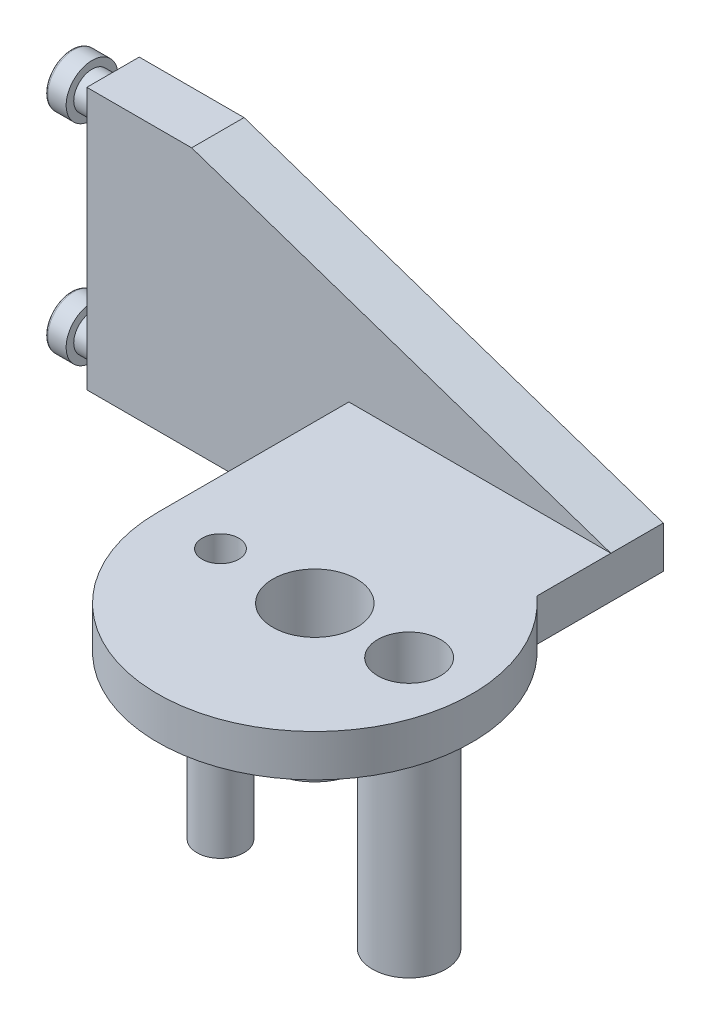
ISO-10303-21;
HEADER;
FILE_DESCRIPTION(('STEP AP214'),'2;1');
FILE_NAME('part.step','',(''),(''),'','','');
FILE_SCHEMA(('AUTOMOTIVE_DESIGN { 1 0 10303 214 1 1 1 1 }'));
ENDSEC;
DATA;
#1=APPLICATION_CONTEXT('core data for automotive mechanical design processes');
#2=APPLICATION_PROTOCOL_DEFINITION('international standard','automotive_design',2000,#1);
#3=PRODUCT_CONTEXT('',#1,'mechanical');
#4=PRODUCT('Part','Part','',(#3));
#5=PRODUCT_RELATED_PRODUCT_CATEGORY('part','',(#4));
#6=PRODUCT_DEFINITION_FORMATION('','',#4);
#7=PRODUCT_DEFINITION_CONTEXT('part definition',#1,'design');
#8=PRODUCT_DEFINITION('design','',#6,#7);
#9=PRODUCT_DEFINITION_SHAPE('','',#8);
#10=(LENGTH_UNIT() NAMED_UNIT(*) SI_UNIT(.MILLI.,.METRE.));
#11=(NAMED_UNIT(*) PLANE_ANGLE_UNIT() SI_UNIT($,.RADIAN.));
#12=(NAMED_UNIT(*) SI_UNIT($,.STERADIAN.) SOLID_ANGLE_UNIT());
#13=UNCERTAINTY_MEASURE_WITH_UNIT(LENGTH_MEASURE(1.E-05),#10,'distance_accuracy_value','');
#14=(GEOMETRIC_REPRESENTATION_CONTEXT(3) GLOBAL_UNCERTAINTY_ASSIGNED_CONTEXT((#13)) GLOBAL_UNIT_ASSIGNED_CONTEXT((#10,
#11,#12)) REPRESENTATION_CONTEXT('',''));
#15=CARTESIAN_POINT('',(0.,0.,0.));
#16=DIRECTION('',(0.,0.,1.));
#17=DIRECTION('',(1.,0.,0.));
#18=AXIS2_PLACEMENT_3D('',#15,#16,#17);
#19=CARTESIAN_POINT('',(-50.,-25.,10.));
#20=DIRECTION('',(1.,0.,0.));
#21=DIRECTION('',(0.,0.,-1.));
#22=AXIS2_PLACEMENT_3D('',#19,#20,#21);
#23=PLANE('',#22);
#24=CARTESIAN_POINT('',(-50.,20.,5.));
#25=DIRECTION('',(1.,0.,0.));
#26=DIRECTION('',(0.,0.,-1.));
#27=AXIS2_PLACEMENT_3D('',#24,#25,#26);
#28=CIRCLE('',#27,3.5);
#29=CARTESIAN_POINT('',(-50.,20.,1.5));
#30=VERTEX_POINT('',#29);
#31=EDGE_CURVE('E177',#30,#30,#28,.F.);
#32=ORIENTED_EDGE('',*,*,#31,.F.);
#33=EDGE_LOOP('',(#32));
#34=FACE_BOUND('',#33,.T.);
#35=CARTESIAN_POINT('',(-50.,-20.,5.));
#36=DIRECTION('',(1.,0.,0.));
#37=DIRECTION('',(0.,0.,-1.));
#38=AXIS2_PLACEMENT_3D('',#35,#36,#37);
#39=CIRCLE('',#38,3.5);
#40=CARTESIAN_POINT('',(-50.,-20.,1.5));
#41=VERTEX_POINT('',#40);
#42=EDGE_CURVE('E173',#41,#41,#39,.F.);
#43=ORIENTED_EDGE('',*,*,#42,.F.);
#44=EDGE_LOOP('',(#43));
#45=FACE_BOUND('',#44,.T.);
#46=DIRECTION('',(0.,-1.,0.));
#47=VECTOR('',#46,1.);
#48=CARTESIAN_POINT('',(-50.,-25.,0.));
#49=LINE('',#48,#47);
#50=CARTESIAN_POINT('',(-50.,25.,0.));
#51=VERTEX_POINT('',#50);
#52=CARTESIAN_POINT('',(-50.,-25.,0.));
#53=VERTEX_POINT('',#52);
#54=EDGE_CURVE('E160',#51,#53,#49,.T.);
#55=ORIENTED_EDGE('',*,*,#54,.T.);
#56=DIRECTION('',(0.,0.,-1.));
#57=VECTOR('',#56,1.);
#58=CARTESIAN_POINT('',(-50.,-25.,10.));
#59=LINE('',#58,#57);
#60=CARTESIAN_POINT('',(-50.,-25.,10.));
#61=VERTEX_POINT('',#60);
#62=EDGE_CURVE('E168',#61,#53,#59,.T.);
#63=ORIENTED_EDGE('',*,*,#62,.F.);
#64=DIRECTION('',(0.,-1.,0.));
#65=VECTOR('',#64,1.);
#66=CARTESIAN_POINT('',(-50.,-25.,10.));
#67=LINE('',#66,#65);
#68=CARTESIAN_POINT('',(-50.,25.,10.));
#69=VERTEX_POINT('',#68);
#70=EDGE_CURVE('E158',#69,#61,#67,.T.);
#71=ORIENTED_EDGE('',*,*,#70,.F.);
#72=DIRECTION('',(0.,0.,-1.));
#73=VECTOR('',#72,1.);
#74=CARTESIAN_POINT('',(-50.,25.,10.));
#75=LINE('',#74,#73);
#76=EDGE_CURVE('E164',#69,#51,#75,.T.);
#77=ORIENTED_EDGE('',*,*,#76,.T.);
#78=EDGE_LOOP('',(#55,#63,#71,#77));
#79=FACE_BOUND('',#78,.T.);
#80=ADVANCED_FACE('F47',(#34,#45,#79),#23,.F.);
#81=CARTESIAN_POINT('',(50.,-25.,10.));
#82=DIRECTION('',(0.,1.,0.));
#83=DIRECTION('',(-1.,0.,0.));
#84=AXIS2_PLACEMENT_3D('',#81,#82,#83);
#85=PLANE('',#84);
#86=DIRECTION('',(1.,0.,0.));
#87=VECTOR('',#86,1.);
#88=CARTESIAN_POINT('',(50.,-25.,0.));
#89=LINE('',#88,#87);
#90=CARTESIAN_POINT('',(-17.9999999999998,-25.,0.));
#91=VERTEX_POINT('',#90);
#92=EDGE_CURVE('E154',#53,#91,#89,.T.);
#93=ORIENTED_EDGE('',*,*,#92,.T.);
#94=DIRECTION('',(0.,0.,1.));
#95=VECTOR('',#94,1.);
#96=CARTESIAN_POINT('',(-18.,-25.,0.));
#97=LINE('',#96,#95);
#98=CARTESIAN_POINT('',(-18.,-25.,10.));
#99=VERTEX_POINT('',#98);
#100=EDGE_CURVE('E130',#91,#99,#97,.T.);
#101=ORIENTED_EDGE('',*,*,#100,.T.);
#102=DIRECTION('',(1.,0.,0.));
#103=VECTOR('',#102,1.);
#104=CARTESIAN_POINT('',(50.,-25.,10.));
#105=LINE('',#104,#103);
#106=EDGE_CURVE('E363',#61,#99,#105,.T.);
#107=ORIENTED_EDGE('',*,*,#106,.F.);
#108=ORIENTED_EDGE('',*,*,#62,.T.);
#109=EDGE_LOOP('',(#93,#101,#107,#108));
#110=FACE_BOUND('',#109,.T.);
#111=ADVANCED_FACE('F240',(#110),#85,.F.);
#112=CARTESIAN_POINT('',(50.,25.,10.));
#113=DIRECTION('',(-1.,0.,0.));
#114=DIRECTION('',(0.,0.,1.));
#115=AXIS2_PLACEMENT_3D('',#112,#113,#114);
#116=PLANE('',#115);
#117=DIRECTION('',(0.,0.,-1.));
#118=VECTOR('',#117,1.);
#119=CARTESIAN_POINT('',(50.,-10.,10.));
#120=LINE('',#119,#118);
#121=CARTESIAN_POINT('',(50.,-10.,24.1393202250021));
#122=VERTEX_POINT('',#121);
#123=CARTESIAN_POINT('',(50.,-10.,10.));
#124=VERTEX_POINT('',#123);
#125=EDGE_CURVE('E145',#122,#124,#120,.T.);
#126=ORIENTED_EDGE('',*,*,#125,.T.);
#127=DIRECTION('',(0.,0.,1.));
#128=VECTOR('',#127,1.);
#129=CARTESIAN_POINT('',(50.,-10.,0.));
#130=LINE('',#129,#128);
#131=CARTESIAN_POINT('',(50.,-10.,0.));
#132=VERTEX_POINT('',#131);
#133=EDGE_CURVE('E127',#132,#124,#130,.T.);
#134=ORIENTED_EDGE('',*,*,#133,.F.);
#135=DIRECTION('',(0.,1.,0.));
#136=VECTOR('',#135,1.);
#137=CARTESIAN_POINT('',(50.,25.,0.));
#138=LINE('',#137,#136);
#139=CARTESIAN_POINT('',(50.,-2.,0.));
#140=VERTEX_POINT('',#139);
#141=EDGE_CURVE('E141',#132,#140,#138,.T.);
#142=ORIENTED_EDGE('',*,*,#141,.T.);
#143=DIRECTION('',(0.,0.,1.));
#144=VECTOR('',#143,1.);
#145=CARTESIAN_POINT('',(50.,-2.,0.));
#146=LINE('',#145,#144);
#147=CARTESIAN_POINT('',(50.,-2.,10.));
#148=VERTEX_POINT('',#147);
#149=EDGE_CURVE('E317',#140,#148,#146,.T.);
#150=ORIENTED_EDGE('',*,*,#149,.T.);
#151=DIRECTION('',(0.,0.,1.));
#152=VECTOR('',#151,1.);
#153=CARTESIAN_POINT('',(50.,-2.00000000000001,10.));
#154=LINE('',#153,#152);
#155=CARTESIAN_POINT('',(50.,-2.,24.1393202250021));
#156=VERTEX_POINT('',#155);
#157=EDGE_CURVE('E332',#148,#156,#154,.T.);
#158=ORIENTED_EDGE('',*,*,#157,.T.);
#159=DIRECTION('',(0.,1.,0.));
#160=VECTOR('',#159,1.);
#161=CARTESIAN_POINT('',(50.,-25.,24.1393202250021));
#162=LINE('',#161,#160);
#163=EDGE_CURVE('E336',#122,#156,#162,.T.);
#164=ORIENTED_EDGE('',*,*,#163,.F.);
#165=EDGE_LOOP('',(#126,#134,#142,#150,#158,#164));
#166=FACE_BOUND('',#165,.T.);
#167=ADVANCED_FACE('F139',(#166),#116,.F.);
#168=CARTESIAN_POINT('',(-50.,25.,10.));
#169=DIRECTION('',(0.,-1.,0.));
#170=DIRECTION('',(0.,0.,-1.));
#171=AXIS2_PLACEMENT_3D('',#168,#169,#170);
#172=PLANE('',#171);
#173=DIRECTION('',(-1.,0.,0.));
#174=VECTOR('',#173,1.);
#175=CARTESIAN_POINT('',(-50.,25.,10.));
#176=LINE('',#175,#174);
#177=CARTESIAN_POINT('',(-30.,25.,10.));
#178=VERTEX_POINT('',#177);
#179=EDGE_CURVE('E169',#178,#69,#176,.T.);
#180=ORIENTED_EDGE('',*,*,#179,.F.);
#181=DIRECTION('',(0.,0.,1.));
#182=VECTOR('',#181,1.);
#183=CARTESIAN_POINT('',(-30.,25.,0.));
#184=LINE('',#183,#182);
#185=CARTESIAN_POINT('',(-30.,25.,0.));
#186=VERTEX_POINT('',#185);
#187=EDGE_CURVE('E314',#186,#178,#184,.T.);
#188=ORIENTED_EDGE('',*,*,#187,.F.);
#189=DIRECTION('',(-1.,0.,0.));
#190=VECTOR('',#189,1.);
#191=CARTESIAN_POINT('',(-50.,25.,0.));
#192=LINE('',#191,#190);
#193=EDGE_CURVE('E153',#186,#51,#192,.T.);
#194=ORIENTED_EDGE('',*,*,#193,.T.);
#195=ORIENTED_EDGE('',*,*,#76,.F.);
#196=EDGE_LOOP('',(#180,#188,#194,#195));
#197=FACE_BOUND('',#196,.T.);
#198=ADVANCED_FACE('F384',(#197),#172,.F.);
#199=CARTESIAN_POINT('',(0.,0.,10.));
#200=DIRECTION('',(0.,0.,-1.));
#201=DIRECTION('',(-1.,0.,0.));
#202=AXIS2_PLACEMENT_3D('',#199,#200,#201);
#203=PLANE('',#202);
#204=ORIENTED_EDGE('',*,*,#106,.T.);
#205=DIRECTION('',(-0.976523773463931,-0.215409655911161,0.));
#206=VECTOR('',#205,1.);
#207=CARTESIAN_POINT('',(50.,-10.,10.));
#208=LINE('',#207,#206);
#209=EDGE_CURVE('E135',#124,#99,#208,.T.);
#210=ORIENTED_EDGE('',*,*,#209,.F.);
#211=DIRECTION('',(-1.,0.,0.));
#212=VECTOR('',#211,1.);
#213=CARTESIAN_POINT('',(60.,-10.,9.99999999999999));
#214=LINE('',#213,#212);
#215=CARTESIAN_POINT('',(0.,-10.,10.));
#216=VERTEX_POINT('',#215);
#217=EDGE_CURVE('E303',#124,#216,#214,.T.);
#218=ORIENTED_EDGE('',*,*,#217,.T.);
#219=DIRECTION('',(0.,1.,0.));
#220=VECTOR('',#219,1.);
#221=CARTESIAN_POINT('',(0.,-25.,10.));
#222=LINE('',#221,#220);
#223=CARTESIAN_POINT('',(0.,-2.,10.));
#224=VERTEX_POINT('',#223);
#225=EDGE_CURVE('E341',#216,#224,#222,.T.);
#226=ORIENTED_EDGE('',*,*,#225,.T.);
#227=DIRECTION('',(-1.,0.,0.));
#228=VECTOR('',#227,1.);
#229=CARTESIAN_POINT('',(60.,-2.00000000000001,9.99999999999999));
#230=LINE('',#229,#228);
#231=EDGE_CURVE('E187',#148,#224,#230,.T.);
#232=ORIENTED_EDGE('',*,*,#231,.F.);
#233=DIRECTION('',(0.947492278987199,-0.31977864415818,0.));
#234=VECTOR('',#233,1.);
#235=CARTESIAN_POINT('',(50.,-2.,10.));
#236=LINE('',#235,#234);
#237=EDGE_CURVE('E311',#178,#148,#236,.T.);
#238=ORIENTED_EDGE('',*,*,#237,.F.);
#239=ORIENTED_EDGE('',*,*,#179,.T.);
#240=ORIENTED_EDGE('',*,*,#70,.T.);
#241=EDGE_LOOP('',(#204,#210,#218,#226,#232,#238,#239,#240));
#242=FACE_BOUND('',#241,.T.);
#243=ADVANCED_FACE('F377',(#242),#203,.F.);
#244=CARTESIAN_POINT('',(0.,0.,0.));
#245=DIRECTION('',(0.,0.,-1.));
#246=DIRECTION('',(-1.,0.,0.));
#247=AXIS2_PLACEMENT_3D('',#244,#245,#246);
#248=PLANE('',#247);
#249=DIRECTION('',(-0.976523773463931,-0.215409655911161,0.));
#250=VECTOR('',#249,1.);
#251=CARTESIAN_POINT('',(50.,-10.,0.));
#252=LINE('',#251,#250);
#253=EDGE_CURVE('E124',#132,#91,#252,.T.);
#254=ORIENTED_EDGE('',*,*,#253,.T.);
#255=ORIENTED_EDGE('',*,*,#92,.F.);
#256=ORIENTED_EDGE('',*,*,#54,.F.);
#257=ORIENTED_EDGE('',*,*,#193,.F.);
#258=DIRECTION('',(0.947492278987199,-0.31977864415818,0.));
#259=VECTOR('',#258,1.);
#260=CARTESIAN_POINT('',(50.,-2.,0.));
#261=LINE('',#260,#259);
#262=EDGE_CURVE('E151',#186,#140,#261,.T.);
#263=ORIENTED_EDGE('',*,*,#262,.T.);
#264=ORIENTED_EDGE('',*,*,#141,.F.);
#265=EDGE_LOOP('',(#254,#255,#256,#257,#263,#264));
#266=FACE_BOUND('',#265,.T.);
#267=ADVANCED_FACE('F149',(#266),#248,.T.);
#268=CARTESIAN_POINT('',(-54.,-20.,5.));
#269=DIRECTION('',(1.,0.,0.));
#270=DIRECTION('',(0.,0.,-1.));
#271=AXIS2_PLACEMENT_3D('',#268,#269,#270);
#272=CYLINDRICAL_SURFACE('',#271,3.5);
#273=CARTESIAN_POINT('',(-54.,-20.,5.));
#274=DIRECTION('',(-1.,0.,0.));
#275=DIRECTION('',(0.,0.,1.));
#276=AXIS2_PLACEMENT_3D('',#273,#274,#275);
#277=CIRCLE('',#276,3.5);
#278=CARTESIAN_POINT('',(-54.,-20.,8.5));
#279=VERTEX_POINT('',#278);
#280=EDGE_CURVE('E350',#279,#279,#277,.T.);
#281=ORIENTED_EDGE('',*,*,#280,.F.);
#282=EDGE_LOOP('',(#281));
#283=FACE_BOUND('',#282,.T.);
#284=ORIENTED_EDGE('',*,*,#42,.T.);
#285=EDGE_LOOP('',(#284));
#286=FACE_BOUND('',#285,.T.);
#287=ADVANCED_FACE('F451',(#283,#286),#272,.T.);
#288=CARTESIAN_POINT('',(-54.,20.,5.));
#289=DIRECTION('',(1.,0.,0.));
#290=DIRECTION('',(0.,0.,-1.));
#291=AXIS2_PLACEMENT_3D('',#288,#289,#290);
#292=CYLINDRICAL_SURFACE('',#291,3.5);
#293=CARTESIAN_POINT('',(-54.,20.,5.));
#294=DIRECTION('',(-1.,0.,0.));
#295=DIRECTION('',(0.,0.,1.));
#296=AXIS2_PLACEMENT_3D('',#293,#294,#295);
#297=CIRCLE('',#296,3.5);
#298=CARTESIAN_POINT('',(-54.,20.,8.5));
#299=VERTEX_POINT('',#298);
#300=EDGE_CURVE('E354',#299,#299,#297,.T.);
#301=ORIENTED_EDGE('',*,*,#300,.F.);
#302=EDGE_LOOP('',(#301));
#303=FACE_BOUND('',#302,.T.);
#304=ORIENTED_EDGE('',*,*,#31,.T.);
#305=EDGE_LOOP('',(#304));
#306=FACE_BOUND('',#305,.T.);
#307=ADVANCED_FACE('F439',(#303,#306),#292,.T.);
#308=CARTESIAN_POINT('',(-58.,20.,5.));
#309=DIRECTION('',(1.,0.,0.));
#310=DIRECTION('',(0.,0.,-1.));
#311=AXIS2_PLACEMENT_3D('',#308,#309,#310);
#312=CYLINDRICAL_SURFACE('',#311,4.95);
#313=CARTESIAN_POINT('',(-57.5,20.,5.));
#314=DIRECTION('',(-1.,0.,0.));
#315=DIRECTION('',(0.,0.,1.));
#316=AXIS2_PLACEMENT_3D('',#313,#314,#315);
#317=CIRCLE('',#316,4.95);
#318=CARTESIAN_POINT('',(-57.5,20.,9.95));
#319=VERTEX_POINT('',#318);
#320=EDGE_CURVE('E11',#319,#319,#317,.F.);
#321=ORIENTED_EDGE('',*,*,#320,.T.);
#322=EDGE_LOOP('',(#321));
#323=FACE_BOUND('',#322,.T.);
#324=CARTESIAN_POINT('',(-54.,20.,5.));
#325=DIRECTION('',(-1.,0.,0.));
#326=DIRECTION('',(0.,0.,1.));
#327=AXIS2_PLACEMENT_3D('',#324,#325,#326);
#328=CIRCLE('',#327,4.95);
#329=CARTESIAN_POINT('',(-54.,20.,9.95));
#330=VERTEX_POINT('',#329);
#331=EDGE_CURVE('E346',#330,#330,#328,.T.);
#332=ORIENTED_EDGE('',*,*,#331,.T.);
#333=EDGE_LOOP('',(#332));
#334=FACE_BOUND('',#333,.T.);
#335=ADVANCED_FACE('F431',(#323,#334),#312,.T.);
#336=CARTESIAN_POINT('',(-58.,20.,5.));
#337=DIRECTION('',(-1.,0.,0.));
#338=DIRECTION('',(0.,0.,1.));
#339=AXIS2_PLACEMENT_3D('',#336,#337,#338);
#340=PLANE('',#339);
#341=CARTESIAN_POINT('',(-58.,20.,5.));
#342=DIRECTION('',(-1.,0.,0.));
#343=DIRECTION('',(0.,0.,1.));
#344=AXIS2_PLACEMENT_3D('',#341,#342,#343);
#345=CIRCLE('',#344,4.45);
#346=CARTESIAN_POINT('',(-58.,20.,9.45));
#347=VERTEX_POINT('',#346);
#348=EDGE_CURVE('E56',#347,#347,#345,.T.);
#349=ORIENTED_EDGE('',*,*,#348,.T.);
#350=EDGE_LOOP('',(#349));
#351=FACE_BOUND('',#350,.T.);
#352=ADVANCED_FACE('F427',(#351),#340,.T.);
#353=CARTESIAN_POINT('',(-54.,20.,5.));
#354=DIRECTION('',(-1.,0.,0.));
#355=DIRECTION('',(0.,0.,1.));
#356=AXIS2_PLACEMENT_3D('',#353,#354,#355);
#357=PLANE('',#356);
#358=ORIENTED_EDGE('',*,*,#300,.T.);
#359=EDGE_LOOP('',(#358));
#360=FACE_BOUND('',#359,.T.);
#361=ORIENTED_EDGE('',*,*,#331,.F.);
#362=EDGE_LOOP('',(#361));
#363=FACE_BOUND('',#362,.T.);
#364=ADVANCED_FACE('F430',(#360,#363),#357,.F.);
#365=CARTESIAN_POINT('',(-58.,-20.,5.));
#366=DIRECTION('',(1.,0.,0.));
#367=DIRECTION('',(0.,0.,-1.));
#368=AXIS2_PLACEMENT_3D('',#365,#366,#367);
#369=CYLINDRICAL_SURFACE('',#368,4.95);
#370=CARTESIAN_POINT('',(-57.5,-20.,5.));
#371=DIRECTION('',(-1.,0.,0.));
#372=DIRECTION('',(0.,0.,1.));
#373=AXIS2_PLACEMENT_3D('',#370,#371,#372);
#374=CIRCLE('',#373,4.95);
#375=CARTESIAN_POINT('',(-57.5,-20.,9.95));
#376=VERTEX_POINT('',#375);
#377=EDGE_CURVE('E744',#376,#376,#374,.F.);
#378=ORIENTED_EDGE('',*,*,#377,.T.);
#379=EDGE_LOOP('',(#378));
#380=FACE_BOUND('',#379,.T.);
#381=CARTESIAN_POINT('',(-54.,-20.,5.));
#382=DIRECTION('',(-1.,0.,0.));
#383=DIRECTION('',(0.,0.,1.));
#384=AXIS2_PLACEMENT_3D('',#381,#382,#383);
#385=CIRCLE('',#384,4.95);
#386=CARTESIAN_POINT('',(-54.,-20.,9.95));
#387=VERTEX_POINT('',#386);
#388=EDGE_CURVE('E340',#387,#387,#385,.T.);
#389=ORIENTED_EDGE('',*,*,#388,.T.);
#390=EDGE_LOOP('',(#389));
#391=FACE_BOUND('',#390,.T.);
#392=ADVANCED_FACE('F435',(#380,#391),#369,.T.);
#393=CARTESIAN_POINT('',(-58.,-20.,5.));
#394=DIRECTION('',(-1.,0.,0.));
#395=DIRECTION('',(0.,0.,1.));
#396=AXIS2_PLACEMENT_3D('',#393,#394,#395);
#397=PLANE('',#396);
#398=CARTESIAN_POINT('',(-58.,-20.,5.));
#399=DIRECTION('',(-1.,0.,0.));
#400=DIRECTION('',(0.,0.,1.));
#401=AXIS2_PLACEMENT_3D('',#398,#399,#400);
#402=CIRCLE('',#401,4.45);
#403=CARTESIAN_POINT('',(-58.,-20.,9.45));
#404=VERTEX_POINT('',#403);
#405=EDGE_CURVE('E208',#404,#404,#402,.T.);
#406=ORIENTED_EDGE('',*,*,#405,.T.);
#407=EDGE_LOOP('',(#406));
#408=FACE_BOUND('',#407,.T.);
#409=ADVANCED_FACE('F443',(#408),#397,.T.);
#410=CARTESIAN_POINT('',(-54.,-20.,5.));
#411=DIRECTION('',(-1.,0.,0.));
#412=DIRECTION('',(0.,0.,1.));
#413=AXIS2_PLACEMENT_3D('',#410,#411,#412);
#414=PLANE('',#413);
#415=ORIENTED_EDGE('',*,*,#280,.T.);
#416=EDGE_LOOP('',(#415));
#417=FACE_BOUND('',#416,.T.);
#418=ORIENTED_EDGE('',*,*,#388,.F.);
#419=EDGE_LOOP('',(#418));
#420=FACE_BOUND('',#419,.T.);
#421=ADVANCED_FACE('F426',(#417,#420),#414,.F.);
#422=CARTESIAN_POINT('',(30.,-25.,46.5));
#423=DIRECTION('',(0.,1.,0.));
#424=DIRECTION('',(0.,0.,1.));
#425=AXIS2_PLACEMENT_3D('',#422,#423,#424);
#426=CYLINDRICAL_SURFACE('',#425,30.);
#427=CARTESIAN_POINT('',(30.,-10.,46.5));
#428=DIRECTION('',(0.,1.,0.));
#429=DIRECTION('',(0.,0.,1.));
#430=AXIS2_PLACEMENT_3D('',#427,#428,#429);
#431=CIRCLE('',#430,30.);
#432=CARTESIAN_POINT('',(0.,-10.,46.5));
#433=VERTEX_POINT('',#432);
#434=EDGE_CURVE('E306',#122,#433,#431,.F.);
#435=ORIENTED_EDGE('',*,*,#434,.F.);
#436=ORIENTED_EDGE('',*,*,#163,.T.);
#437=CARTESIAN_POINT('',(30.,-2.,46.5));
#438=DIRECTION('',(0.,-1.,0.));
#439=DIRECTION('',(0.,0.,-1.));
#440=AXIS2_PLACEMENT_3D('',#437,#438,#439);
#441=CIRCLE('',#440,30.);
#442=CARTESIAN_POINT('',(0.,-2.,46.5));
#443=VERTEX_POINT('',#442);
#444=EDGE_CURVE('E328',#443,#156,#441,.F.);
#445=ORIENTED_EDGE('',*,*,#444,.F.);
#446=DIRECTION('',(0.,1.,0.));
#447=VECTOR('',#446,1.);
#448=CARTESIAN_POINT('',(0.,-25.,46.5));
#449=LINE('',#448,#447);
#450=EDGE_CURVE('E337',#433,#443,#449,.T.);
#451=ORIENTED_EDGE('',*,*,#450,.F.);
#452=EDGE_LOOP('',(#435,#436,#445,#451));
#453=FACE_BOUND('',#452,.T.);
#454=ADVANCED_FACE('F398',(#453),#426,.T.);
#455=CARTESIAN_POINT('',(0.,-25.,46.5));
#456=DIRECTION('',(-1.,0.,0.));
#457=DIRECTION('',(0.,0.,1.));
#458=AXIS2_PLACEMENT_3D('',#455,#456,#457);
#459=PLANE('',#458);
#460=DIRECTION('',(0.,0.,-1.));
#461=VECTOR('',#460,1.);
#462=CARTESIAN_POINT('',(0.,-10.,10.));
#463=LINE('',#462,#461);
#464=EDGE_CURVE('E298',#433,#216,#463,.T.);
#465=ORIENTED_EDGE('',*,*,#464,.F.);
#466=ORIENTED_EDGE('',*,*,#450,.T.);
#467=DIRECTION('',(0.,0.,1.));
#468=VECTOR('',#467,1.);
#469=CARTESIAN_POINT('',(0.,-2.,46.5));
#470=LINE('',#469,#468);
#471=EDGE_CURVE('E186',#224,#443,#470,.T.);
#472=ORIENTED_EDGE('',*,*,#471,.F.);
#473=ORIENTED_EDGE('',*,*,#225,.F.);
#474=EDGE_LOOP('',(#465,#466,#472,#473));
#475=FACE_BOUND('',#474,.T.);
#476=ADVANCED_FACE('F395',(#475),#459,.T.);
#477=CARTESIAN_POINT('',(30.,-25.,46.5));
#478=DIRECTION('',(0.,1.,0.));
#479=DIRECTION('',(0.,0.,1.));
#480=AXIS2_PLACEMENT_3D('',#477,#478,#479);
#481=CYLINDRICAL_SURFACE('',#480,8.);
#482=CARTESIAN_POINT('',(30.,-2.,46.5));
#483=DIRECTION('',(0.,-1.,0.));
#484=DIRECTION('',(0.,0.,-1.));
#485=AXIS2_PLACEMENT_3D('',#482,#483,#484);
#486=CIRCLE('',#485,8.);
#487=CARTESIAN_POINT('',(30.,-2.,38.5));
#488=VERTEX_POINT('',#487);
#489=EDGE_CURVE('E182',#488,#488,#486,.F.);
#490=ORIENTED_EDGE('',*,*,#489,.T.);
#491=EDGE_LOOP('',(#490));
#492=FACE_BOUND('',#491,.T.);
#493=CARTESIAN_POINT('',(30.,-25.,46.5));
#494=DIRECTION('',(0.,-1.,0.));
#495=DIRECTION('',(0.,0.,-1.));
#496=AXIS2_PLACEMENT_3D('',#493,#494,#495);
#497=CIRCLE('',#496,8.);
#498=CARTESIAN_POINT('',(30.,-25.,38.5));
#499=VERTEX_POINT('',#498);
#500=EDGE_CURVE('E217',#499,#499,#497,.T.);
#501=ORIENTED_EDGE('',*,*,#500,.T.);
#502=EDGE_LOOP('',(#501));
#503=FACE_BOUND('',#502,.T.);
#504=ADVANCED_FACE('F417',(#492,#503),#481,.F.);
#505=CARTESIAN_POINT('',(60.,-2.,76.5));
#506=DIRECTION('',(0.,-1.,0.));
#507=DIRECTION('',(0.,0.,-1.));
#508=AXIS2_PLACEMENT_3D('',#505,#506,#507);
#509=PLANE('',#508);
#510=CARTESIAN_POINT('',(12.,-2.,46.5));
#511=DIRECTION('',(0.,1.,0.));
#512=DIRECTION('',(0.,0.,1.));
#513=AXIS2_PLACEMENT_3D('',#510,#511,#512);
#514=CIRCLE('',#513,3.5);
#515=CARTESIAN_POINT('',(12.,-2.,50.));
#516=VERTEX_POINT('',#515);
#517=EDGE_CURVE('E283',#516,#516,#514,.T.);
#518=ORIENTED_EDGE('',*,*,#517,.F.);
#519=EDGE_LOOP('',(#518));
#520=FACE_BOUND('',#519,.T.);
#521=CARTESIAN_POINT('',(48.,-2.,46.5));
#522=DIRECTION('',(0.,1.,0.));
#523=DIRECTION('',(0.,0.,1.));
#524=AXIS2_PLACEMENT_3D('',#521,#522,#523);
#525=CIRCLE('',#524,5.99999999999999);
#526=CARTESIAN_POINT('',(48.,-2.,52.5));
#527=VERTEX_POINT('',#526);
#528=EDGE_CURVE('E277',#527,#527,#525,.T.);
#529=ORIENTED_EDGE('',*,*,#528,.F.);
#530=EDGE_LOOP('',(#529));
#531=FACE_BOUND('',#530,.T.);
#532=ORIENTED_EDGE('',*,*,#489,.F.);
#533=EDGE_LOOP('',(#532));
#534=FACE_BOUND('',#533,.T.);
#535=ORIENTED_EDGE('',*,*,#231,.T.);
#536=ORIENTED_EDGE('',*,*,#471,.T.);
#537=ORIENTED_EDGE('',*,*,#444,.T.);
#538=ORIENTED_EDGE('',*,*,#157,.F.);
#539=EDGE_LOOP('',(#535,#536,#537,#538));
#540=FACE_BOUND('',#539,.T.);
#541=ADVANCED_FACE('F389',(#520,#531,#534,#540),#509,.F.);
#542=CARTESIAN_POINT('',(50.,-2.,0.));
#543=DIRECTION('',(-0.31977864415818,-0.947492278987199,0.));
#544=DIRECTION('',(0.947492278987199,-0.31977864415818,0.));
#545=AXIS2_PLACEMENT_3D('',#542,#543,#544);
#546=PLANE('',#545);
#547=ORIENTED_EDGE('',*,*,#237,.T.);
#548=ORIENTED_EDGE('',*,*,#149,.F.);
#549=ORIENTED_EDGE('',*,*,#262,.F.);
#550=ORIENTED_EDGE('',*,*,#187,.T.);
#551=EDGE_LOOP('',(#547,#548,#549,#550));
#552=FACE_BOUND('',#551,.T.);
#553=ADVANCED_FACE('F386',(#552),#546,.F.);
#554=CARTESIAN_POINT('',(60.,-10.,9.99999999999999));
#555=DIRECTION('',(0.,1.,0.));
#556=DIRECTION('',(0.,0.,1.));
#557=AXIS2_PLACEMENT_3D('',#554,#555,#556);
#558=PLANE('',#557);
#559=CARTESIAN_POINT('',(12.,-10.,46.5));
#560=DIRECTION('',(0.,1.,0.));
#561=DIRECTION('',(0.,0.,1.));
#562=AXIS2_PLACEMENT_3D('',#559,#560,#561);
#563=CIRCLE('',#562,6.5);
#564=CARTESIAN_POINT('',(12.,-10.,53.));
#565=VERTEX_POINT('',#564);
#566=EDGE_CURVE('E196',#565,#565,#563,.T.);
#567=ORIENTED_EDGE('',*,*,#566,.T.);
#568=EDGE_LOOP('',(#567));
#569=FACE_BOUND('',#568,.T.);
#570=CARTESIAN_POINT('',(48.,-10.,46.5));
#571=DIRECTION('',(0.,1.,0.));
#572=DIRECTION('',(0.,0.,1.));
#573=AXIS2_PLACEMENT_3D('',#570,#571,#572);
#574=CIRCLE('',#573,9.);
#575=CARTESIAN_POINT('',(40.265625,-10.,51.102112923362));
#576=VERTEX_POINT('',#575);
#577=CARTESIAN_POINT('',(40.265625,-10.,41.897887076638));
#578=VERTEX_POINT('',#577);
#579=EDGE_CURVE('E62',#576,#578,#574,.T.);
#580=ORIENTED_EDGE('',*,*,#579,.T.);
#581=CARTESIAN_POINT('',(30.,-10.,46.5));
#582=DIRECTION('',(0.,1.,0.));
#583=DIRECTION('',(0.,0.,1.));
#584=AXIS2_PLACEMENT_3D('',#581,#582,#583);
#585=CIRCLE('',#584,11.25);
#586=EDGE_CURVE('E193',#578,#576,#585,.T.);
#587=ORIENTED_EDGE('',*,*,#586,.T.);
#588=EDGE_LOOP('',(#580,#587));
#589=FACE_BOUND('',#588,.T.);
#590=ORIENTED_EDGE('',*,*,#125,.F.);
#591=ORIENTED_EDGE('',*,*,#434,.T.);
#592=ORIENTED_EDGE('',*,*,#464,.T.);
#593=ORIENTED_EDGE('',*,*,#217,.F.);
#594=EDGE_LOOP('',(#590,#591,#592,#593));
#595=FACE_BOUND('',#594,.T.);
#596=ADVANCED_FACE('F400',(#569,#589,#595),#558,.F.);
#597=CARTESIAN_POINT('',(50.,-10.,0.));
#598=DIRECTION('',(-0.215409655911161,0.976523773463931,0.));
#599=DIRECTION('',(-0.976523773463931,-0.215409655911161,0.));
#600=AXIS2_PLACEMENT_3D('',#597,#598,#599);
#601=PLANE('',#600);
#602=ORIENTED_EDGE('',*,*,#209,.T.);
#603=ORIENTED_EDGE('',*,*,#100,.F.);
#604=ORIENTED_EDGE('',*,*,#253,.F.);
#605=ORIENTED_EDGE('',*,*,#133,.T.);
#606=EDGE_LOOP('',(#602,#603,#604,#605));
#607=FACE_BOUND('',#606,.T.);
#608=ADVANCED_FACE('F126',(#607),#601,.F.);
#609=CARTESIAN_POINT('',(48.,-25.,46.5));
#610=DIRECTION('',(0.,1.,0.));
#611=DIRECTION('',(0.,0.,1.));
#612=AXIS2_PLACEMENT_3D('',#609,#610,#611);
#613=CYLINDRICAL_SURFACE('',#612,5.99999999999999);
#614=ORIENTED_EDGE('',*,*,#528,.T.);
#615=EDGE_LOOP('',(#614));
#616=FACE_BOUND('',#615,.T.);
#617=CARTESIAN_POINT('',(48.,-50.,46.5));
#618=DIRECTION('',(0.,1.,0.));
#619=DIRECTION('',(0.,0.,1.));
#620=AXIS2_PLACEMENT_3D('',#617,#618,#619);
#621=CIRCLE('',#620,5.99999999999999);
#622=CARTESIAN_POINT('',(48.,-50.,52.5));
#623=VERTEX_POINT('',#622);
#624=EDGE_CURVE('E286',#623,#623,#621,.T.);
#625=ORIENTED_EDGE('',*,*,#624,.F.);
#626=EDGE_LOOP('',(#625));
#627=FACE_BOUND('',#626,.T.);
#628=ADVANCED_FACE('F409',(#616,#627),#613,.F.);
#629=CARTESIAN_POINT('',(12.,-25.,46.5));
#630=DIRECTION('',(0.,1.,0.));
#631=DIRECTION('',(0.,0.,1.));
#632=AXIS2_PLACEMENT_3D('',#629,#630,#631);
#633=CYLINDRICAL_SURFACE('',#632,3.5);
#634=ORIENTED_EDGE('',*,*,#517,.T.);
#635=EDGE_LOOP('',(#634));
#636=FACE_BOUND('',#635,.T.);
#637=CARTESIAN_POINT('',(12.,-50.,46.5));
#638=DIRECTION('',(0.,1.,0.));
#639=DIRECTION('',(0.,0.,1.));
#640=AXIS2_PLACEMENT_3D('',#637,#638,#639);
#641=CIRCLE('',#640,3.5);
#642=CARTESIAN_POINT('',(12.,-50.,50.));
#643=VERTEX_POINT('',#642);
#644=EDGE_CURVE('E289',#643,#643,#641,.T.);
#645=ORIENTED_EDGE('',*,*,#644,.F.);
#646=EDGE_LOOP('',(#645));
#647=FACE_BOUND('',#646,.T.);
#648=ADVANCED_FACE('F497',(#636,#647),#633,.F.);
#649=CARTESIAN_POINT('',(48.,-50.,46.5));
#650=DIRECTION('',(0.,1.,0.));
#651=DIRECTION('',(0.,0.,1.));
#652=AXIS2_PLACEMENT_3D('',#649,#650,#651);
#653=CYLINDRICAL_SURFACE('',#652,7.);
#654=CARTESIAN_POINT('',(48.,-12.,46.5));
#655=DIRECTION('',(0.,1.,0.));
#656=DIRECTION('',(0.,0.,1.));
#657=AXIS2_PLACEMENT_3D('',#654,#655,#656);
#658=CIRCLE('',#657,7.);
#659=CARTESIAN_POINT('',(48.,-12.,53.5));
#660=VERTEX_POINT('',#659);
#661=EDGE_CURVE('E204',#660,#660,#658,.F.);
#662=ORIENTED_EDGE('',*,*,#661,.T.);
#663=EDGE_LOOP('',(#662));
#664=FACE_BOUND('',#663,.T.);
#665=CARTESIAN_POINT('',(48.,-50.,46.5));
#666=DIRECTION('',(0.,-1.,0.));
#667=DIRECTION('',(0.,0.,-1.));
#668=AXIS2_PLACEMENT_3D('',#665,#666,#667);
#669=CIRCLE('',#668,7.);
#670=CARTESIAN_POINT('',(48.,-50.,39.5));
#671=VERTEX_POINT('',#670);
#672=EDGE_CURVE('E278',#671,#671,#669,.T.);
#673=ORIENTED_EDGE('',*,*,#672,.F.);
#674=EDGE_LOOP('',(#673));
#675=FACE_BOUND('',#674,.T.);
#676=ADVANCED_FACE('F505',(#664,#675),#653,.T.);
#677=CARTESIAN_POINT('',(48.,-50.,46.5));
#678=DIRECTION('',(0.,-1.,0.));
#679=DIRECTION('',(0.,0.,-1.));
#680=AXIS2_PLACEMENT_3D('',#677,#678,#679);
#681=PLANE('',#680);
#682=ORIENTED_EDGE('',*,*,#624,.T.);
#683=EDGE_LOOP('',(#682));
#684=FACE_BOUND('',#683,.T.);
#685=ORIENTED_EDGE('',*,*,#672,.T.);
#686=EDGE_LOOP('',(#685));
#687=FACE_BOUND('',#686,.T.);
#688=ADVANCED_FACE('F270',(#684,#687),#681,.T.);
#689=CARTESIAN_POINT('',(12.,-50.,46.5));
#690=DIRECTION('',(0.,1.,0.));
#691=DIRECTION('',(0.,0.,1.));
#692=AXIS2_PLACEMENT_3D('',#689,#690,#691);
#693=CYLINDRICAL_SURFACE('',#692,4.5);
#694=CARTESIAN_POINT('',(12.,-12.,46.5));
#695=DIRECTION('',(0.,1.,0.));
#696=DIRECTION('',(0.,0.,1.));
#697=AXIS2_PLACEMENT_3D('',#694,#695,#696);
#698=CIRCLE('',#697,4.5);
#699=CARTESIAN_POINT('',(12.,-12.,51.));
#700=VERTEX_POINT('',#699);
#701=EDGE_CURVE('E181',#700,#700,#698,.F.);
#702=ORIENTED_EDGE('',*,*,#701,.T.);
#703=EDGE_LOOP('',(#702));
#704=FACE_BOUND('',#703,.T.);
#705=CARTESIAN_POINT('',(12.,-50.,46.5));
#706=DIRECTION('',(0.,-1.,0.));
#707=DIRECTION('',(0.,0.,-1.));
#708=AXIS2_PLACEMENT_3D('',#705,#706,#707);
#709=CIRCLE('',#708,4.5);
#710=CARTESIAN_POINT('',(12.,-50.,42.));
#711=VERTEX_POINT('',#710);
#712=EDGE_CURVE('E274',#711,#711,#709,.T.);
#713=ORIENTED_EDGE('',*,*,#712,.F.);
#714=EDGE_LOOP('',(#713));
#715=FACE_BOUND('',#714,.T.);
#716=ADVANCED_FACE('F266',(#704,#715),#693,.T.);
#717=CARTESIAN_POINT('',(12.,-50.,46.5));
#718=DIRECTION('',(0.,-1.,0.));
#719=DIRECTION('',(0.,0.,-1.));
#720=AXIS2_PLACEMENT_3D('',#717,#718,#719);
#721=PLANE('',#720);
#722=ORIENTED_EDGE('',*,*,#644,.T.);
#723=EDGE_LOOP('',(#722));
#724=FACE_BOUND('',#723,.T.);
#725=ORIENTED_EDGE('',*,*,#712,.T.);
#726=EDGE_LOOP('',(#725));
#727=FACE_BOUND('',#726,.T.);
#728=ADVANCED_FACE('F269',(#724,#727),#721,.T.);
#729=CARTESIAN_POINT('',(30.,-25.,46.5));
#730=DIRECTION('',(0.,-1.,0.));
#731=DIRECTION('',(0.,0.,-1.));
#732=AXIS2_PLACEMENT_3D('',#729,#730,#731);
#733=PLANE('',#732);
#734=ORIENTED_EDGE('',*,*,#500,.F.);
#735=EDGE_LOOP('',(#734));
#736=FACE_BOUND('',#735,.T.);
#737=CARTESIAN_POINT('',(30.,-25.,46.5));
#738=DIRECTION('',(0.,-1.,0.));
#739=DIRECTION('',(0.,0.,-1.));
#740=AXIS2_PLACEMENT_3D('',#737,#738,#739);
#741=CIRCLE('',#740,9.25);
#742=CARTESIAN_POINT('',(30.,-25.,37.25));
#743=VERTEX_POINT('',#742);
#744=EDGE_CURVE('E708',#743,#743,#741,.T.);
#745=ORIENTED_EDGE('',*,*,#744,.T.);
#746=EDGE_LOOP('',(#745));
#747=FACE_BOUND('',#746,.T.);
#748=ADVANCED_FACE('F259',(#736,#747),#733,.T.);
#749=CARTESIAN_POINT('',(30.,-25.,46.5));
#750=DIRECTION('',(0.,1.,0.));
#751=DIRECTION('',(0.,0.,1.));
#752=AXIS2_PLACEMENT_3D('',#749,#750,#751);
#753=CYLINDRICAL_SURFACE('',#752,9.25);
#754=CARTESIAN_POINT('',(30.,-12.,46.5));
#755=DIRECTION('',(0.,1.,0.));
#756=DIRECTION('',(0.,0.,1.));
#757=AXIS2_PLACEMENT_3D('',#754,#755,#756);
#758=CIRCLE('',#757,9.25);
#759=CARTESIAN_POINT('',(30.,-12.,55.75));
#760=VERTEX_POINT('',#759);
#761=EDGE_CURVE('E200',#760,#760,#758,.F.);
#762=ORIENTED_EDGE('',*,*,#761,.T.);
#763=EDGE_LOOP('',(#762));
#764=FACE_BOUND('',#763,.T.);
#765=ORIENTED_EDGE('',*,*,#744,.F.);
#766=EDGE_LOOP('',(#765));
#767=FACE_BOUND('',#766,.T.);
#768=ADVANCED_FACE('F254',(#764,#767),#753,.T.);
#769=CARTESIAN_POINT('',(12.,-12.,46.5));
#770=DIRECTION('',(0.,1.,0.));
#771=DIRECTION('',(0.,0.,1.));
#772=AXIS2_PLACEMENT_3D('',#769,#770,#771);
#773=TOROIDAL_SURFACE('',#772,6.5,2.);
#774=ORIENTED_EDGE('',*,*,#566,.F.);
#775=EDGE_LOOP('',(#774));
#776=FACE_BOUND('',#775,.T.);
#777=ORIENTED_EDGE('',*,*,#701,.F.);
#778=EDGE_LOOP('',(#777));
#779=FACE_BOUND('',#778,.T.);
#780=ADVANCED_FACE('F226',(#776,#779),#773,.F.);
#781=CARTESIAN_POINT('',(48.,-12.,46.5));
#782=DIRECTION('',(0.,1.,0.));
#783=DIRECTION('',(0.,0.,1.));
#784=AXIS2_PLACEMENT_3D('',#781,#782,#783);
#785=TOROIDAL_SURFACE('',#784,9.,2.);
#786=ORIENTED_EDGE('',*,*,#661,.F.);
#787=EDGE_LOOP('',(#786));
#788=FACE_BOUND('',#787,.T.);
#789=CARTESIAN_POINT('',(40.265625,-10.,51.102112923362));
#790=CARTESIAN_POINT('',(40.2654350691082,-10.0000000032642,51.0988222591292));
#791=CARTESIAN_POINT('',(40.2652452985106,-10.0000017346666,51.0955315806066));
#792=CARTESIAN_POINT('',(40.2554313654048,-10.0001803631155,50.9252102767544));
#793=CARTESIAN_POINT('',(40.2462207723164,-10.0047864462889,50.7581465783416));
#794=CARTESIAN_POINT('',(40.228699701844,-10.0206787370236,50.4242782016881));
#795=CARTESIAN_POINT('',(40.2203895140673,-10.0319670863751,50.2574736236947));
#796=CARTESIAN_POINT('',(40.1968689993581,-10.0728420162811,49.7571029884791));
#797=CARTESIAN_POINT('',(40.1830980792077,-10.1094254871232,49.4240841815775));
#798=CARTESIAN_POINT('',(40.1597342893428,-10.1854533418459,48.7586661583255));
#799=CARTESIAN_POINT('',(40.1501368346871,-10.2248945303794,48.4262666635357));
#800=CARTESIAN_POINT('',(40.1390878892881,-10.2747786717844,47.9269634317766));
#801=CARTESIAN_POINT('',(40.1359644069985,-10.2898487781521,47.7605977909771));
#802=CARTESIAN_POINT('',(40.1308607369806,-10.3152892616726,47.4274979008843));
#803=CARTESIAN_POINT('',(40.1288804459608,-10.3256600634065,47.2607636862599));
#804=CARTESIAN_POINT('',(40.125678249976,-10.3426267118916,46.87770021926));
#805=CARTESIAN_POINT('',(40.124853171256,-10.3472024866583,46.6612699252616));
#806=CARTESIAN_POINT('',(40.1251897175551,-10.3453749701193,46.2284617930778));
#807=CARTESIAN_POINT('',(40.1263513522794,-10.3389716251803,46.0120839551539));
#808=CARTESIAN_POINT('',(40.1306370067384,-10.3164872595108,45.5792723726086));
#809=CARTESIAN_POINT('',(40.1337665658757,-10.3003789261192,45.3628401998265));
#810=CARTESIAN_POINT('',(40.1419258615496,-10.26157207252,44.930614113354));
#811=CARTESIAN_POINT('',(40.146955838347,-10.2388727191251,44.7148202838442));
#812=CARTESIAN_POINT('',(40.1588420440983,-10.1908379495617,44.2833246356655));
#813=CARTESIAN_POINT('',(40.1657005223758,-10.1654993102387,44.0676232603067));
#814=CARTESIAN_POINT('',(40.1811598577801,-10.1164326482684,43.6360591885891));
#815=CARTESIAN_POINT('',(40.1897609307906,-10.0927048256661,43.4201964755473));
#816=CARTESIAN_POINT('',(40.2085949544572,-10.0511694127023,42.9884842149813));
#817=CARTESIAN_POINT('',(40.2188238298848,-10.0333473717995,42.7726359468779));
#818=CARTESIAN_POINT('',(40.2408228223589,-10.0078814202985,42.3404264794445));
#819=CARTESIAN_POINT('',(40.2525920886034,-10.0002319169574,42.1240656275328));
#820=CARTESIAN_POINT('',(40.2652452983941,-10.0000017365749,41.9044684197085));
#821=CARTESIAN_POINT('',(40.2654350689875,-10.0000000052066,41.9011777412345));
#822=CARTESIAN_POINT('',(40.265625,-10.,41.897887076638));
#823=B_SPLINE_CURVE_WITH_KNOTS('',3,(#789,#790,#791,#792,#793,#794,#795,#796,#797,#798,#799,
#800,#801,#802,#803,#804,#805,#806,#807,#808,#809,#810,#811,#812,#813,#814,#815,#816,#817,#818,
#819,#820,#821,#822),.UNSPECIFIED.,.F.,.F.,(4,2,2,2,2,2,2,2,2,2,2,2,2,2,2,2,4),(0.,
0.00988843769975836,0.511810867569113,1.01389426004833,2.01957359860132,3.02414529603794,
3.52531350134294,4.02643641719043,4.67559013614967,5.3247470262517,5.97573942267674,
6.62681414852067,7.27869351658805,7.9306536930087,8.58100663655976,9.23100187560592,
9.24089031330568),.UNSPECIFIED.);
#824=EDGE_CURVE('E68',#578,#576,#823,.F.);
#825=ORIENTED_EDGE('',*,*,#824,.F.);
#826=ORIENTED_EDGE('',*,*,#579,.F.);
#827=EDGE_LOOP('',(#825,#826));
#828=FACE_BOUND('',#827,.T.);
#829=ADVANCED_FACE('F221',(#788,#828),#785,.F.);
#830=CARTESIAN_POINT('',(30.,-12.,46.5));
#831=DIRECTION('',(0.,1.,0.));
#832=DIRECTION('',(0.,0.,1.));
#833=AXIS2_PLACEMENT_3D('',#830,#831,#832);
#834=TOROIDAL_SURFACE('',#833,11.25,2.);
#835=ORIENTED_EDGE('',*,*,#586,.F.);
#836=ORIENTED_EDGE('',*,*,#824,.T.);
#837=EDGE_LOOP('',(#835,#836));
#838=FACE_BOUND('',#837,.T.);
#839=ORIENTED_EDGE('',*,*,#761,.F.);
#840=EDGE_LOOP('',(#839));
#841=FACE_BOUND('',#840,.T.);
#842=ADVANCED_FACE('F225',(#838,#841),#834,.F.);
#843=CARTESIAN_POINT('',(-57.5,-20.,5.));
#844=DIRECTION('',(-1.,0.,0.));
#845=DIRECTION('',(0.,0.,1.));
#846=AXIS2_PLACEMENT_3D('',#843,#844,#845);
#847=TOROIDAL_SURFACE('',#846,4.45,0.5);
#848=ORIENTED_EDGE('',*,*,#377,.F.);
#849=EDGE_LOOP('',(#848));
#850=FACE_BOUND('',#849,.T.);
#851=ORIENTED_EDGE('',*,*,#405,.F.);
#852=EDGE_LOOP('',(#851));
#853=FACE_BOUND('',#852,.T.);
#854=ADVANCED_FACE('F229',(#850,#853),#847,.T.);
#855=CARTESIAN_POINT('',(-57.5,20.,5.));
#856=DIRECTION('',(-1.,0.,0.));
#857=DIRECTION('',(0.,0.,1.));
#858=AXIS2_PLACEMENT_3D('',#855,#856,#857);
#859=TOROIDAL_SURFACE('',#858,4.45,0.5);
#860=ORIENTED_EDGE('',*,*,#320,.F.);
#861=EDGE_LOOP('',(#860));
#862=FACE_BOUND('',#861,.T.);
#863=ORIENTED_EDGE('',*,*,#348,.F.);
#864=EDGE_LOOP('',(#863));
#865=FACE_BOUND('',#864,.T.);
#866=ADVANCED_FACE('F49',(#862,#865),#859,.T.);
#867=CLOSED_SHELL('',(#80,#111,#167,#198,#243,#267,#287,#307,#335,#352,#364,#392,#409,#421,#454,
#476,#504,#541,#553,#596,#608,#628,#648,#676,#688,#716,#728,#748,#768,#780,#829,#842,#854,#866));
#868=MANIFOLD_SOLID_BREP('B2',#867);
#869=ADVANCED_BREP_SHAPE_REPRESENTATION('',(#18,#868),#14);
#870=SHAPE_DEFINITION_REPRESENTATION(#9,#869);
ENDSEC;
END-ISO-10303-21;
